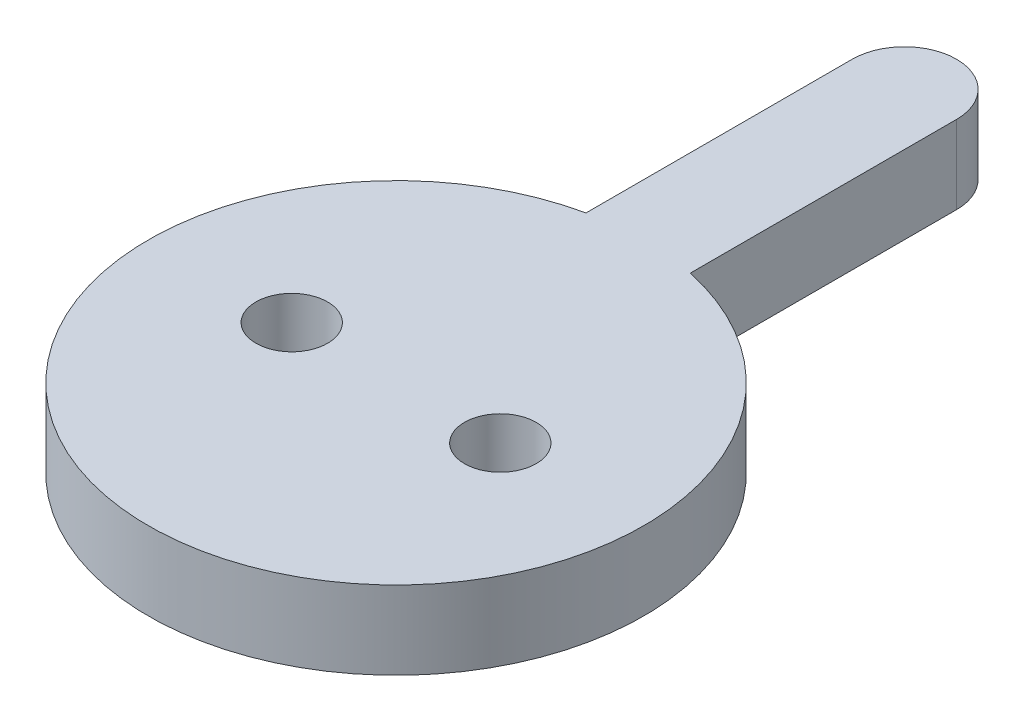
ISO-10303-21;
HEADER;
FILE_DESCRIPTION(('STEP AP214'),'2;1');
FILE_NAME('part.step','',(''),(''),'','','');
FILE_SCHEMA(('AUTOMOTIVE_DESIGN { 1 0 10303 214 1 1 1 1 }'));
ENDSEC;
DATA;
#1=APPLICATION_CONTEXT('core data for automotive mechanical design processes');
#2=APPLICATION_PROTOCOL_DEFINITION('international standard','automotive_design',2000,#1);
#3=PRODUCT_CONTEXT('',#1,'mechanical');
#4=PRODUCT('Part','Part','',(#3));
#5=PRODUCT_RELATED_PRODUCT_CATEGORY('part','',(#4));
#6=PRODUCT_DEFINITION_FORMATION('','',#4);
#7=PRODUCT_DEFINITION_CONTEXT('part definition',#1,'design');
#8=PRODUCT_DEFINITION('design','',#6,#7);
#9=PRODUCT_DEFINITION_SHAPE('','',#8);
#10=(LENGTH_UNIT() NAMED_UNIT(*) SI_UNIT(.MILLI.,.METRE.));
#11=(NAMED_UNIT(*) PLANE_ANGLE_UNIT() SI_UNIT($,.RADIAN.));
#12=(NAMED_UNIT(*) SI_UNIT($,.STERADIAN.) SOLID_ANGLE_UNIT());
#13=UNCERTAINTY_MEASURE_WITH_UNIT(LENGTH_MEASURE(1.E-05),#10,'distance_accuracy_value','');
#14=(GEOMETRIC_REPRESENTATION_CONTEXT(3) GLOBAL_UNCERTAINTY_ASSIGNED_CONTEXT((#13)) GLOBAL_UNIT_ASSIGNED_CONTEXT((#10,
#11,#12)) REPRESENTATION_CONTEXT('',''));
#15=CARTESIAN_POINT('',(0.,0.,0.));
#16=DIRECTION('',(0.,0.,1.));
#17=DIRECTION('',(1.,0.,0.));
#18=AXIS2_PLACEMENT_3D('',#15,#16,#17);
#19=CARTESIAN_POINT('',(-3.99999999999999,6.,0.));
#20=DIRECTION('',(1.,0.,0.));
#21=DIRECTION('',(0.,0.,-1.));
#22=AXIS2_PLACEMENT_3D('',#19,#20,#21);
#23=PLANE('',#22);
#24=DIRECTION('',(0.,0.,1.));
#25=VECTOR('',#24,1.);
#26=CARTESIAN_POINT('',(-3.99999999999999,0.,0.));
#27=LINE('',#26,#25);
#28=CARTESIAN_POINT('',(-4.,0.,-39.));
#29=VERTEX_POINT('',#28);
#30=CARTESIAN_POINT('',(-4.,0.,-18.5741756210067));
#31=VERTEX_POINT('',#30);
#32=EDGE_CURVE('E114',#29,#31,#27,.T.);
#33=ORIENTED_EDGE('',*,*,#32,.T.);
#34=DIRECTION('',(0.,-1.,0.));
#35=VECTOR('',#34,1.);
#36=CARTESIAN_POINT('',(-4.,6.,-18.5741756210067));
#37=LINE('',#36,#35);
#38=CARTESIAN_POINT('',(-4.,6.,-18.5741756210067));
#39=VERTEX_POINT('',#38);
#40=EDGE_CURVE('E55',#39,#31,#37,.T.);
#41=ORIENTED_EDGE('',*,*,#40,.F.);
#42=DIRECTION('',(0.,0.,1.));
#43=VECTOR('',#42,1.);
#44=CARTESIAN_POINT('',(-3.99999999999999,6.,0.));
#45=LINE('',#44,#43);
#46=CARTESIAN_POINT('',(-4.,6.,-39.));
#47=VERTEX_POINT('',#46);
#48=EDGE_CURVE('E98',#47,#39,#45,.T.);
#49=ORIENTED_EDGE('',*,*,#48,.F.);
#50=DIRECTION('',(0.,-1.,0.));
#51=VECTOR('',#50,1.);
#52=CARTESIAN_POINT('',(-4.,6.,-39.));
#53=LINE('',#52,#51);
#54=EDGE_CURVE('E64',#47,#29,#53,.T.);
#55=ORIENTED_EDGE('',*,*,#54,.T.);
#56=EDGE_LOOP('',(#33,#41,#49,#55));
#57=FACE_BOUND('',#56,.T.);
#58=ADVANCED_FACE('F46',(#57),#23,.F.);
#59=CARTESIAN_POINT('',(0.,6.,0.));
#60=DIRECTION('',(0.,-1.,0.));
#61=DIRECTION('',(0.,0.,-1.));
#62=AXIS2_PLACEMENT_3D('',#59,#60,#61);
#63=CYLINDRICAL_SURFACE('',#62,19.);
#64=CARTESIAN_POINT('',(0.,0.,0.));
#65=DIRECTION('',(0.,1.,0.));
#66=DIRECTION('',(0.,0.,1.));
#67=AXIS2_PLACEMENT_3D('',#64,#65,#66);
#68=CIRCLE('',#67,19.);
#69=CARTESIAN_POINT('',(4.,0.,-18.5741756210067));
#70=VERTEX_POINT('',#69);
#71=EDGE_CURVE('E104',#31,#70,#68,.T.);
#72=ORIENTED_EDGE('',*,*,#71,.T.);
#73=DIRECTION('',(0.,-1.,0.));
#74=VECTOR('',#73,1.);
#75=CARTESIAN_POINT('',(4.,6.,-18.5741756210067));
#76=LINE('',#75,#74);
#77=CARTESIAN_POINT('',(4.,6.,-18.5741756210067));
#78=VERTEX_POINT('',#77);
#79=EDGE_CURVE('E102',#78,#70,#76,.T.);
#80=ORIENTED_EDGE('',*,*,#79,.F.);
#81=CARTESIAN_POINT('',(0.,6.,0.));
#82=DIRECTION('',(0.,1.,0.));
#83=DIRECTION('',(0.,0.,1.));
#84=AXIS2_PLACEMENT_3D('',#81,#82,#83);
#85=CIRCLE('',#84,19.);
#86=EDGE_CURVE('E90',#39,#78,#85,.T.);
#87=ORIENTED_EDGE('',*,*,#86,.F.);
#88=ORIENTED_EDGE('',*,*,#40,.T.);
#89=EDGE_LOOP('',(#72,#80,#87,#88));
#90=FACE_BOUND('',#89,.T.);
#91=ADVANCED_FACE('F103',(#90),#63,.T.);
#92=CARTESIAN_POINT('',(4.00000000000001,6.,0.));
#93=DIRECTION('',(1.,0.,0.));
#94=DIRECTION('',(0.,0.,-1.));
#95=AXIS2_PLACEMENT_3D('',#92,#93,#94);
#96=PLANE('',#95);
#97=DIRECTION('',(0.,0.,1.));
#98=VECTOR('',#97,1.);
#99=CARTESIAN_POINT('',(4.00000000000001,0.,0.));
#100=LINE('',#99,#98);
#101=CARTESIAN_POINT('',(4.,0.,-39.));
#102=VERTEX_POINT('',#101);
#103=EDGE_CURVE('E118',#102,#70,#100,.T.);
#104=ORIENTED_EDGE('',*,*,#103,.F.);
#105=DIRECTION('',(0.,-1.,0.));
#106=VECTOR('',#105,1.);
#107=CARTESIAN_POINT('',(4.,6.,-39.));
#108=LINE('',#107,#106);
#109=CARTESIAN_POINT('',(4.,6.,-39.));
#110=VERTEX_POINT('',#109);
#111=EDGE_CURVE('E78',#110,#102,#108,.T.);
#112=ORIENTED_EDGE('',*,*,#111,.F.);
#113=DIRECTION('',(0.,0.,1.));
#114=VECTOR('',#113,1.);
#115=CARTESIAN_POINT('',(4.00000000000001,6.,0.));
#116=LINE('',#115,#114);
#117=EDGE_CURVE('E97',#110,#78,#116,.T.);
#118=ORIENTED_EDGE('',*,*,#117,.T.);
#119=ORIENTED_EDGE('',*,*,#79,.T.);
#120=EDGE_LOOP('',(#104,#112,#118,#119));
#121=FACE_BOUND('',#120,.T.);
#122=ADVANCED_FACE('F108',(#121),#96,.T.);
#123=CARTESIAN_POINT('',(0.,6.,-39.));
#124=DIRECTION('',(0.,-1.,0.));
#125=DIRECTION('',(0.,0.,-1.));
#126=AXIS2_PLACEMENT_3D('',#123,#124,#125);
#127=CYLINDRICAL_SURFACE('',#126,4.);
#128=CARTESIAN_POINT('',(0.,0.,-39.));
#129=DIRECTION('',(0.,1.,0.));
#130=DIRECTION('',(0.,0.,1.));
#131=AXIS2_PLACEMENT_3D('',#128,#129,#130);
#132=CIRCLE('',#131,4.);
#133=EDGE_CURVE('E120',#29,#102,#132,.F.);
#134=ORIENTED_EDGE('',*,*,#133,.F.);
#135=ORIENTED_EDGE('',*,*,#54,.F.);
#136=CARTESIAN_POINT('',(0.,6.,-39.));
#137=DIRECTION('',(0.,1.,0.));
#138=DIRECTION('',(0.,0.,1.));
#139=AXIS2_PLACEMENT_3D('',#136,#137,#138);
#140=CIRCLE('',#139,4.);
#141=EDGE_CURVE('E109',#47,#110,#140,.F.);
#142=ORIENTED_EDGE('',*,*,#141,.T.);
#143=ORIENTED_EDGE('',*,*,#111,.T.);
#144=EDGE_LOOP('',(#134,#135,#142,#143));
#145=FACE_BOUND('',#144,.T.);
#146=ADVANCED_FACE('F154',(#145),#127,.T.);
#147=CARTESIAN_POINT('',(0.,6.,0.));
#148=DIRECTION('',(0.,1.,0.));
#149=DIRECTION('',(0.,0.,1.));
#150=AXIS2_PLACEMENT_3D('',#147,#148,#149);
#151=PLANE('',#150);
#152=CARTESIAN_POINT('',(8.,6.,0.));
#153=DIRECTION('',(0.,1.,0.));
#154=DIRECTION('',(0.,0.,1.));
#155=AXIS2_PLACEMENT_3D('',#152,#153,#154);
#156=CIRCLE('',#155,2.75);
#157=CARTESIAN_POINT('',(8.,6.,2.75));
#158=VERTEX_POINT('',#157);
#159=EDGE_CURVE('E127',#158,#158,#156,.T.);
#160=ORIENTED_EDGE('',*,*,#159,.F.);
#161=EDGE_LOOP('',(#160));
#162=FACE_BOUND('',#161,.T.);
#163=CARTESIAN_POINT('',(-8.,6.,0.));
#164=DIRECTION('',(0.,1.,0.));
#165=DIRECTION('',(0.,0.,1.));
#166=AXIS2_PLACEMENT_3D('',#163,#164,#165);
#167=CIRCLE('',#166,2.75);
#168=CARTESIAN_POINT('',(-8.,6.,2.75));
#169=VERTEX_POINT('',#168);
#170=EDGE_CURVE('E132',#169,#169,#167,.T.);
#171=ORIENTED_EDGE('',*,*,#170,.F.);
#172=EDGE_LOOP('',(#171));
#173=FACE_BOUND('',#172,.T.);
#174=ORIENTED_EDGE('',*,*,#48,.T.);
#175=ORIENTED_EDGE('',*,*,#86,.T.);
#176=ORIENTED_EDGE('',*,*,#117,.F.);
#177=ORIENTED_EDGE('',*,*,#141,.F.);
#178=EDGE_LOOP('',(#174,#175,#176,#177));
#179=FACE_BOUND('',#178,.T.);
#180=ADVANCED_FACE('F94',(#162,#173,#179),#151,.T.);
#181=CARTESIAN_POINT('',(0.,0.,0.));
#182=DIRECTION('',(0.,1.,0.));
#183=DIRECTION('',(0.,0.,1.));
#184=AXIS2_PLACEMENT_3D('',#181,#182,#183);
#185=PLANE('',#184);
#186=CARTESIAN_POINT('',(0.,0.,0.));
#187=DIRECTION('',(0.,1.,0.));
#188=DIRECTION('',(0.,0.,1.));
#189=AXIS2_PLACEMENT_3D('',#186,#187,#188);
#190=CIRCLE('',#189,14.86);
#191=CARTESIAN_POINT('',(0.,0.,14.86));
#192=VERTEX_POINT('',#191);
#193=EDGE_CURVE('E11',#192,#192,#190,.F.);
#194=ORIENTED_EDGE('',*,*,#193,.F.);
#195=EDGE_LOOP('',(#194));
#196=FACE_BOUND('',#195,.T.);
#197=ORIENTED_EDGE('',*,*,#32,.F.);
#198=ORIENTED_EDGE('',*,*,#133,.T.);
#199=ORIENTED_EDGE('',*,*,#103,.T.);
#200=ORIENTED_EDGE('',*,*,#71,.F.);
#201=EDGE_LOOP('',(#197,#198,#199,#200));
#202=FACE_BOUND('',#201,.T.);
#203=ADVANCED_FACE('F147',(#196,#202),#185,.F.);
#204=CARTESIAN_POINT('',(0.,-2.,0.));
#205=DIRECTION('',(0.,1.,0.));
#206=DIRECTION('',(0.,0.,1.));
#207=AXIS2_PLACEMENT_3D('',#204,#205,#206);
#208=CYLINDRICAL_SURFACE('',#207,14.86);
#209=CARTESIAN_POINT('',(0.,-2.,0.));
#210=DIRECTION('',(0.,-1.,0.));
#211=DIRECTION('',(0.,0.,-1.));
#212=AXIS2_PLACEMENT_3D('',#209,#210,#211);
#213=CIRCLE('',#212,14.86);
#214=CARTESIAN_POINT('',(0.,-2.,-14.86));
#215=VERTEX_POINT('',#214);
#216=EDGE_CURVE('E116',#215,#215,#213,.T.);
#217=ORIENTED_EDGE('',*,*,#216,.F.);
#218=EDGE_LOOP('',(#217));
#219=FACE_BOUND('',#218,.T.);
#220=ORIENTED_EDGE('',*,*,#193,.T.);
#221=EDGE_LOOP('',(#220));
#222=FACE_BOUND('',#221,.T.);
#223=ADVANCED_FACE('F144',(#219,#222),#208,.T.);
#224=CARTESIAN_POINT('',(0.,-2.,0.));
#225=DIRECTION('',(0.,-1.,0.));
#226=DIRECTION('',(0.,0.,-1.));
#227=AXIS2_PLACEMENT_3D('',#224,#225,#226);
#228=PLANE('',#227);
#229=CARTESIAN_POINT('',(8.,-2.,0.));
#230=DIRECTION('',(0.,-1.,0.));
#231=DIRECTION('',(0.,0.,-1.));
#232=AXIS2_PLACEMENT_3D('',#229,#230,#231);
#233=CIRCLE('',#232,2.75);
#234=CARTESIAN_POINT('',(8.,-2.,-2.75));
#235=VERTEX_POINT('',#234);
#236=EDGE_CURVE('E49',#235,#235,#233,.T.);
#237=ORIENTED_EDGE('',*,*,#236,.F.);
#238=EDGE_LOOP('',(#237));
#239=FACE_BOUND('',#238,.T.);
#240=CARTESIAN_POINT('',(-8.,-2.,0.));
#241=DIRECTION('',(0.,-1.,0.));
#242=DIRECTION('',(0.,0.,-1.));
#243=AXIS2_PLACEMENT_3D('',#240,#241,#242);
#244=CIRCLE('',#243,2.75);
#245=CARTESIAN_POINT('',(-8.,-2.,-2.75));
#246=VERTEX_POINT('',#245);
#247=EDGE_CURVE('E125',#246,#246,#244,.T.);
#248=ORIENTED_EDGE('',*,*,#247,.F.);
#249=EDGE_LOOP('',(#248));
#250=FACE_BOUND('',#249,.T.);
#251=ORIENTED_EDGE('',*,*,#216,.T.);
#252=EDGE_LOOP('',(#251));
#253=FACE_BOUND('',#252,.T.);
#254=ADVANCED_FACE('F142',(#239,#250,#253),#228,.T.);
#255=CARTESIAN_POINT('',(-8.,-4.,0.));
#256=DIRECTION('',(0.,1.,0.));
#257=DIRECTION('',(0.,0.,1.));
#258=AXIS2_PLACEMENT_3D('',#255,#256,#257);
#259=CYLINDRICAL_SURFACE('',#258,2.75);
#260=ORIENTED_EDGE('',*,*,#247,.T.);
#261=EDGE_LOOP('',(#260));
#262=FACE_BOUND('',#261,.T.);
#263=ORIENTED_EDGE('',*,*,#170,.T.);
#264=EDGE_LOOP('',(#263));
#265=FACE_BOUND('',#264,.T.);
#266=ADVANCED_FACE('F225',(#262,#265),#259,.F.);
#267=CARTESIAN_POINT('',(8.,-4.,0.));
#268=DIRECTION('',(0.,1.,0.));
#269=DIRECTION('',(0.,0.,1.));
#270=AXIS2_PLACEMENT_3D('',#267,#268,#269);
#271=CYLINDRICAL_SURFACE('',#270,2.75);
#272=ORIENTED_EDGE('',*,*,#236,.T.);
#273=EDGE_LOOP('',(#272));
#274=FACE_BOUND('',#273,.T.);
#275=ORIENTED_EDGE('',*,*,#159,.T.);
#276=EDGE_LOOP('',(#275));
#277=FACE_BOUND('',#276,.T.);
#278=ADVANCED_FACE('F235',(#274,#277),#271,.F.);
#279=CLOSED_SHELL('',(#58,#91,#122,#146,#180,#203,#223,#254,#266,#278));
#280=MANIFOLD_SOLID_BREP('B2',#279);
#281=ADVANCED_BREP_SHAPE_REPRESENTATION('',(#18,#280),#14);
#282=SHAPE_DEFINITION_REPRESENTATION(#9,#281);
ENDSEC;
END-ISO-10303-21;
